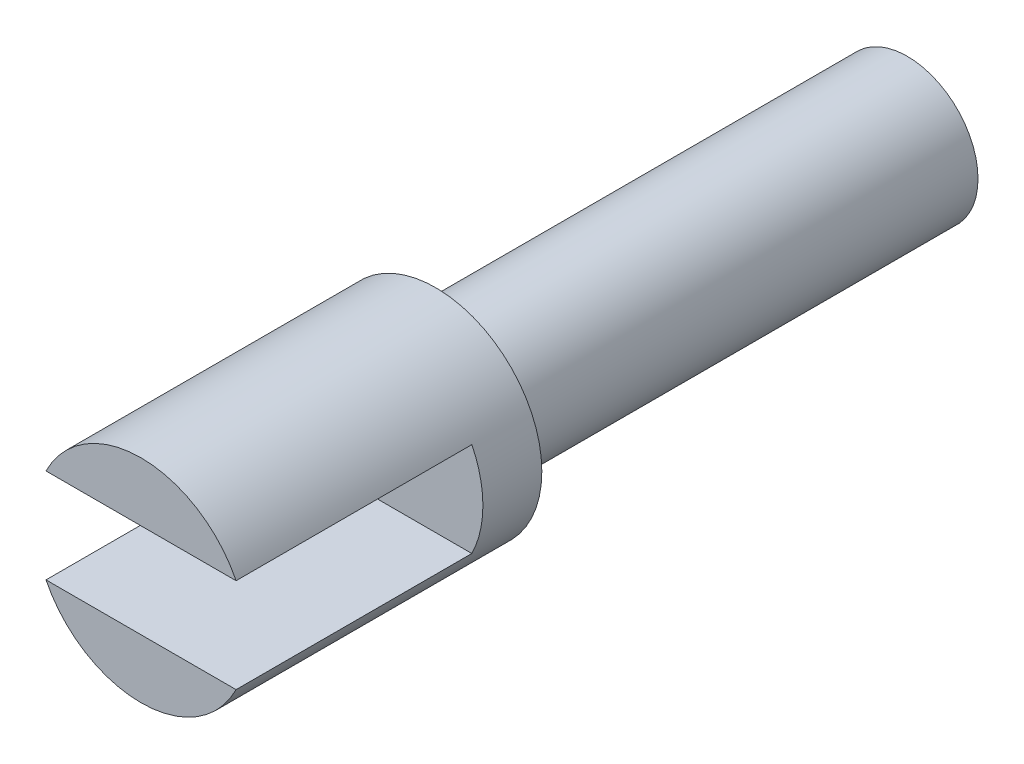
ISO-10303-21;
HEADER;
FILE_DESCRIPTION(('STEP AP214'),'2;1');
FILE_NAME('part.step','',(''),(''),'','','');
FILE_SCHEMA(('AUTOMOTIVE_DESIGN { 1 0 10303 214 1 1 1 1 }'));
ENDSEC;
DATA;
#1=APPLICATION_CONTEXT('core data for automotive mechanical design processes');
#2=APPLICATION_PROTOCOL_DEFINITION('international standard','automotive_design',2000,#1);
#3=PRODUCT_CONTEXT('',#1,'mechanical');
#4=PRODUCT('Part','Part','',(#3));
#5=PRODUCT_RELATED_PRODUCT_CATEGORY('part','',(#4));
#6=PRODUCT_DEFINITION_FORMATION('','',#4);
#7=PRODUCT_DEFINITION_CONTEXT('part definition',#1,'design');
#8=PRODUCT_DEFINITION('design','',#6,#7);
#9=PRODUCT_DEFINITION_SHAPE('','',#8);
#10=(LENGTH_UNIT() NAMED_UNIT(*) SI_UNIT(.MILLI.,.METRE.));
#11=(NAMED_UNIT(*) PLANE_ANGLE_UNIT() SI_UNIT($,.RADIAN.));
#12=(NAMED_UNIT(*) SI_UNIT($,.STERADIAN.) SOLID_ANGLE_UNIT());
#13=UNCERTAINTY_MEASURE_WITH_UNIT(LENGTH_MEASURE(1.E-05),#10,'distance_accuracy_value','');
#14=(GEOMETRIC_REPRESENTATION_CONTEXT(3) GLOBAL_UNCERTAINTY_ASSIGNED_CONTEXT((#13)) GLOBAL_UNIT_ASSIGNED_CONTEXT((#10,
#11,#12)) REPRESENTATION_CONTEXT('',''));
#15=CARTESIAN_POINT('',(0.,0.,0.));
#16=DIRECTION('',(0.,0.,1.));
#17=DIRECTION('',(1.,0.,0.));
#18=AXIS2_PLACEMENT_3D('',#15,#16,#17);
#19=CARTESIAN_POINT('',(0.,0.,25.));
#20=DIRECTION('',(0.,0.,1.));
#21=DIRECTION('',(1.,0.,0.));
#22=AXIS2_PLACEMENT_3D('',#19,#20,#21);
#23=PLANE('',#22);
#24=DIRECTION('',(-1.,0.,0.));
#25=VECTOR('',#24,1.);
#26=CARTESIAN_POINT('',(-9.,4.,25.));
#27=LINE('',#26,#25);
#28=CARTESIAN_POINT('',(8.06225774829855,4.,25.));
#29=VERTEX_POINT('',#28);
#30=CARTESIAN_POINT('',(-8.06225774829855,4.,25.));
#31=VERTEX_POINT('',#30);
#32=EDGE_CURVE('E84',#29,#31,#27,.T.);
#33=ORIENTED_EDGE('',*,*,#32,.F.);
#34=CARTESIAN_POINT('',(0.,0.,25.));
#35=DIRECTION('',(0.,0.,1.));
#36=DIRECTION('',(1.,0.,0.));
#37=AXIS2_PLACEMENT_3D('',#34,#35,#36);
#38=CIRCLE('',#37,9.);
#39=EDGE_CURVE('E90',#29,#31,#38,.T.);
#40=ORIENTED_EDGE('',*,*,#39,.T.);
#41=EDGE_LOOP('',(#33,#40));
#42=FACE_BOUND('',#41,.T.);
#43=ADVANCED_FACE('F37',(#42),#23,.T.);
#44=DIRECTION('',(1.,0.,0.));
#45=VECTOR('',#44,1.);
#46=CARTESIAN_POINT('',(-9.,-4.,25.));
#47=LINE('',#46,#45);
#48=CARTESIAN_POINT('',(-8.06225774829855,-4.,25.));
#49=VERTEX_POINT('',#48);
#50=CARTESIAN_POINT('',(8.06225774829855,-4.,25.));
#51=VERTEX_POINT('',#50);
#52=EDGE_CURVE('E77',#49,#51,#47,.T.);
#53=ORIENTED_EDGE('',*,*,#52,.F.);
#54=EDGE_CURVE('E83',#49,#51,#38,.T.);
#55=ORIENTED_EDGE('',*,*,#54,.T.);
#56=EDGE_LOOP('',(#53,#55));
#57=FACE_BOUND('',#56,.T.);
#58=ADVANCED_FACE('F39',(#57),#23,.T.);
#59=CARTESIAN_POINT('',(0.,0.,44.4099510590377));
#60=DIRECTION('',(0.,0.,1.));
#61=DIRECTION('',(1.,0.,0.));
#62=AXIS2_PLACEMENT_3D('',#59,#60,#61);
#63=CYLINDRICAL_SURFACE('',#62,9.);
#64=CARTESIAN_POINT('',(0.,0.,5.));
#65=DIRECTION('',(0.,0.,1.));
#66=DIRECTION('',(1.,0.,0.));
#67=AXIS2_PLACEMENT_3D('',#64,#65,#66);
#68=CIRCLE('',#67,9.);
#69=CARTESIAN_POINT('',(-8.06225774829855,4.,5.));
#70=VERTEX_POINT('',#69);
#71=CARTESIAN_POINT('',(-8.06225774829855,-4.,5.));
#72=VERTEX_POINT('',#71);
#73=EDGE_CURVE('E57',#70,#72,#68,.T.);
#74=ORIENTED_EDGE('',*,*,#73,.F.);
#75=DIRECTION('',(0.,0.,1.));
#76=VECTOR('',#75,1.);
#77=CARTESIAN_POINT('',(-8.06225774829855,4.,44.4099510590377));
#78=LINE('',#77,#76);
#79=EDGE_CURVE('E11',#70,#31,#78,.T.);
#80=ORIENTED_EDGE('',*,*,#79,.T.);
#81=ORIENTED_EDGE('',*,*,#39,.F.);
#82=DIRECTION('',(0.,0.,1.));
#83=VECTOR('',#82,1.);
#84=CARTESIAN_POINT('',(8.06225774829855,4.,44.4099510590377));
#85=LINE('',#84,#83);
#86=CARTESIAN_POINT('',(8.06225774829855,4.,5.));
#87=VERTEX_POINT('',#86);
#88=EDGE_CURVE('E102',#29,#87,#85,.F.);
#89=ORIENTED_EDGE('',*,*,#88,.T.);
#90=CARTESIAN_POINT('',(8.06225774829855,-4.,5.));
#91=VERTEX_POINT('',#90);
#92=EDGE_CURVE('E94',#91,#87,#68,.T.);
#93=ORIENTED_EDGE('',*,*,#92,.F.);
#94=DIRECTION('',(0.,0.,1.));
#95=VECTOR('',#94,1.);
#96=CARTESIAN_POINT('',(8.06225774829855,-4.,44.4099510590377));
#97=LINE('',#96,#95);
#98=EDGE_CURVE('E89',#91,#51,#97,.T.);
#99=ORIENTED_EDGE('',*,*,#98,.T.);
#100=ORIENTED_EDGE('',*,*,#54,.F.);
#101=DIRECTION('',(0.,0.,1.));
#102=VECTOR('',#101,1.);
#103=CARTESIAN_POINT('',(-8.06225774829855,-4.,44.4099510590377));
#104=LINE('',#103,#102);
#105=EDGE_CURVE('E45',#49,#72,#104,.F.);
#106=ORIENTED_EDGE('',*,*,#105,.T.);
#107=EDGE_LOOP('',(#74,#80,#81,#89,#93,#99,#100,#106));
#108=FACE_BOUND('',#107,.T.);
#109=CARTESIAN_POINT('',(0.,0.,0.));
#110=DIRECTION('',(0.,0.,1.));
#111=DIRECTION('',(1.,0.,0.));
#112=AXIS2_PLACEMENT_3D('',#109,#110,#111);
#113=CIRCLE('',#112,9.);
#114=CARTESIAN_POINT('',(9.,0.,0.));
#115=VERTEX_POINT('',#114);
#116=EDGE_CURVE('E91',#115,#115,#113,.T.);
#117=ORIENTED_EDGE('',*,*,#116,.T.);
#118=EDGE_LOOP('',(#117));
#119=FACE_BOUND('',#118,.T.);
#120=ADVANCED_FACE('F86',(#108,#119),#63,.T.);
#121=CARTESIAN_POINT('',(0.,0.,0.));
#122=DIRECTION('',(0.,0.,1.));
#123=DIRECTION('',(1.,0.,0.));
#124=AXIS2_PLACEMENT_3D('',#121,#122,#123);
#125=PLANE('',#124);
#126=ORIENTED_EDGE('',*,*,#116,.F.);
#127=EDGE_LOOP('',(#126));
#128=FACE_BOUND('',#127,.T.);
#129=CARTESIAN_POINT('',(0.,0.,0.));
#130=DIRECTION('',(0.,0.,1.));
#131=DIRECTION('',(1.,0.,0.));
#132=AXIS2_PLACEMENT_3D('',#129,#130,#131);
#133=CIRCLE('',#132,5.99999999999999);
#134=CARTESIAN_POINT('',(6.,0.,0.));
#135=VERTEX_POINT('',#134);
#136=EDGE_CURVE('E96',#135,#135,#133,.T.);
#137=ORIENTED_EDGE('',*,*,#136,.T.);
#138=EDGE_LOOP('',(#137));
#139=FACE_BOUND('',#138,.T.);
#140=ADVANCED_FACE('F121',(#128,#139),#125,.F.);
#141=CARTESIAN_POINT('',(0.,0.,44.4099510590377));
#142=DIRECTION('',(0.,0.,1.));
#143=DIRECTION('',(1.,0.,0.));
#144=AXIS2_PLACEMENT_3D('',#141,#142,#143);
#145=CYLINDRICAL_SURFACE('',#144,5.99999999999999);
#146=ORIENTED_EDGE('',*,*,#136,.F.);
#147=EDGE_LOOP('',(#146));
#148=FACE_BOUND('',#147,.T.);
#149=CARTESIAN_POINT('',(0.,0.,-40.));
#150=DIRECTION('',(0.,0.,1.));
#151=DIRECTION('',(1.,0.,0.));
#152=AXIS2_PLACEMENT_3D('',#149,#150,#151);
#153=CIRCLE('',#152,5.99999999999999);
#154=CARTESIAN_POINT('',(5.99999999999999,0.,-40.));
#155=VERTEX_POINT('',#154);
#156=EDGE_CURVE('E116',#155,#155,#153,.T.);
#157=ORIENTED_EDGE('',*,*,#156,.T.);
#158=EDGE_LOOP('',(#157));
#159=FACE_BOUND('',#158,.T.);
#160=ADVANCED_FACE('F123',(#148,#159),#145,.T.);
#161=CARTESIAN_POINT('',(0.,0.,-40.));
#162=DIRECTION('',(0.,0.,1.));
#163=DIRECTION('',(1.,0.,0.));
#164=AXIS2_PLACEMENT_3D('',#161,#162,#163);
#165=PLANE('',#164);
#166=ORIENTED_EDGE('',*,*,#156,.F.);
#167=EDGE_LOOP('',(#166));
#168=FACE_BOUND('',#167,.T.);
#169=ADVANCED_FACE('F126',(#168),#165,.F.);
#170=CARTESIAN_POINT('',(-9.,4.,5.));
#171=DIRECTION('',(0.,1.,0.));
#172=DIRECTION('',(0.,0.,1.));
#173=AXIS2_PLACEMENT_3D('',#170,#171,#172);
#174=PLANE('',#173);
#175=DIRECTION('',(-1.,0.,0.));
#176=VECTOR('',#175,1.);
#177=CARTESIAN_POINT('',(-9.,4.,5.));
#178=LINE('',#177,#176);
#179=EDGE_CURVE('E110',#87,#70,#178,.T.);
#180=ORIENTED_EDGE('',*,*,#179,.F.);
#181=ORIENTED_EDGE('',*,*,#88,.F.);
#182=ORIENTED_EDGE('',*,*,#32,.T.);
#183=ORIENTED_EDGE('',*,*,#79,.F.);
#184=EDGE_LOOP('',(#180,#181,#182,#183));
#185=FACE_BOUND('',#184,.T.);
#186=ADVANCED_FACE('F108',(#185),#174,.F.);
#187=CARTESIAN_POINT('',(-9.,-4.,5.));
#188=DIRECTION('',(0.,-1.,0.));
#189=DIRECTION('',(0.,0.,-1.));
#190=AXIS2_PLACEMENT_3D('',#187,#188,#189);
#191=PLANE('',#190);
#192=DIRECTION('',(1.,0.,0.));
#193=VECTOR('',#192,1.);
#194=CARTESIAN_POINT('',(-9.,-4.,5.));
#195=LINE('',#194,#193);
#196=EDGE_CURVE('E52',#72,#91,#195,.T.);
#197=ORIENTED_EDGE('',*,*,#196,.F.);
#198=ORIENTED_EDGE('',*,*,#105,.F.);
#199=ORIENTED_EDGE('',*,*,#52,.T.);
#200=ORIENTED_EDGE('',*,*,#98,.F.);
#201=EDGE_LOOP('',(#197,#198,#199,#200));
#202=FACE_BOUND('',#201,.T.);
#203=ADVANCED_FACE('F76',(#202),#191,.F.);
#204=CARTESIAN_POINT('',(0.,0.,5.));
#205=DIRECTION('',(0.,0.,1.));
#206=DIRECTION('',(1.,0.,0.));
#207=AXIS2_PLACEMENT_3D('',#204,#205,#206);
#208=PLANE('',#207);
#209=ORIENTED_EDGE('',*,*,#179,.T.);
#210=ORIENTED_EDGE('',*,*,#73,.T.);
#211=ORIENTED_EDGE('',*,*,#196,.T.);
#212=ORIENTED_EDGE('',*,*,#92,.T.);
#213=EDGE_LOOP('',(#209,#210,#211,#212));
#214=FACE_BOUND('',#213,.T.);
#215=ADVANCED_FACE('F188',(#214),#208,.T.);
#216=CLOSED_SHELL('',(#43,#58,#120,#140,#160,#169,#186,#203,#215));
#217=MANIFOLD_SOLID_BREP('B2',#216);
#218=ADVANCED_BREP_SHAPE_REPRESENTATION('',(#18,#217),#14);
#219=SHAPE_DEFINITION_REPRESENTATION(#9,#218);
ENDSEC;
END-ISO-10303-21;
